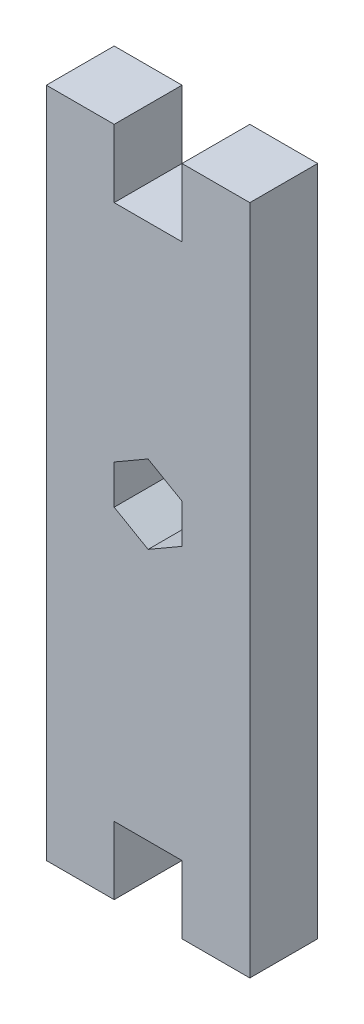
ISO-10303-21;
HEADER;
FILE_DESCRIPTION(('STEP AP214'),'2;1');
FILE_NAME('part.step','',(''),(''),'','','');
FILE_SCHEMA(('AUTOMOTIVE_DESIGN { 1 0 10303 214 1 1 1 1 }'));
ENDSEC;
DATA;
#1=APPLICATION_CONTEXT('core data for automotive mechanical design processes');
#2=APPLICATION_PROTOCOL_DEFINITION('international standard','automotive_design',2000,#1);
#3=PRODUCT_CONTEXT('',#1,'mechanical');
#4=PRODUCT('Part','Part','',(#3));
#5=PRODUCT_RELATED_PRODUCT_CATEGORY('part','',(#4));
#6=PRODUCT_DEFINITION_FORMATION('','',#4);
#7=PRODUCT_DEFINITION_CONTEXT('part definition',#1,'design');
#8=PRODUCT_DEFINITION('design','',#6,#7);
#9=PRODUCT_DEFINITION_SHAPE('','',#8);
#10=(LENGTH_UNIT() NAMED_UNIT(*) SI_UNIT(.MILLI.,.METRE.));
#11=(NAMED_UNIT(*) PLANE_ANGLE_UNIT() SI_UNIT($,.RADIAN.));
#12=(NAMED_UNIT(*) SI_UNIT($,.STERADIAN.) SOLID_ANGLE_UNIT());
#13=UNCERTAINTY_MEASURE_WITH_UNIT(LENGTH_MEASURE(1.E-05),#10,'distance_accuracy_value','');
#14=(GEOMETRIC_REPRESENTATION_CONTEXT(3) GLOBAL_UNCERTAINTY_ASSIGNED_CONTEXT((#13)) GLOBAL_UNIT_ASSIGNED_CONTEXT((#10,
#11,#12)) REPRESENTATION_CONTEXT('',''));
#15=CARTESIAN_POINT('',(0.,0.,0.));
#16=DIRECTION('',(0.,0.,1.));
#17=DIRECTION('',(1.,0.,0.));
#18=AXIS2_PLACEMENT_3D('',#15,#16,#17);
#19=CARTESIAN_POINT('',(-6.53192263334565,2.92543021032505,5.));
#20=DIRECTION('',(1.,0.,0.));
#21=DIRECTION('',(0.,1.,0.));
#22=AXIS2_PLACEMENT_3D('',#19,#20,#21);
#23=PLANE('',#22);
#24=DIRECTION('',(0.,-1.,0.));
#25=VECTOR('',#24,1.);
#26=CARTESIAN_POINT('',(-6.53192263334565,2.92543021032505,0.));
#27=LINE('',#26,#25);
#28=CARTESIAN_POINT('',(-6.53192263334565,2.92543021032505,0.));
#29=VERTEX_POINT('',#28);
#30=CARTESIAN_POINT('',(-6.53192263334564,-46.574569789675,0.));
#31=VERTEX_POINT('',#30);
#32=EDGE_CURVE('E211',#29,#31,#27,.T.);
#33=ORIENTED_EDGE('',*,*,#32,.T.);
#34=DIRECTION('',(0.,0.,-1.));
#35=VECTOR('',#34,1.);
#36=CARTESIAN_POINT('',(-6.53192263334564,-46.574569789675,5.));
#37=LINE('',#36,#35);
#38=CARTESIAN_POINT('',(-6.53192263334564,-46.574569789675,5.));
#39=VERTEX_POINT('',#38);
#40=EDGE_CURVE('E11',#39,#31,#37,.T.);
#41=ORIENTED_EDGE('',*,*,#40,.F.);
#42=DIRECTION('',(0.,-1.,0.));
#43=VECTOR('',#42,1.);
#44=CARTESIAN_POINT('',(-6.53192263334565,2.92543021032505,5.));
#45=LINE('',#44,#43);
#46=CARTESIAN_POINT('',(-6.53192263334565,2.92543021032505,5.));
#47=VERTEX_POINT('',#46);
#48=EDGE_CURVE('E212',#47,#39,#45,.T.);
#49=ORIENTED_EDGE('',*,*,#48,.F.);
#50=DIRECTION('',(0.,0.,-1.));
#51=VECTOR('',#50,1.);
#52=CARTESIAN_POINT('',(-6.53192263334565,2.92543021032505,5.));
#53=LINE('',#52,#51);
#54=EDGE_CURVE('E238',#47,#29,#53,.T.);
#55=ORIENTED_EDGE('',*,*,#54,.T.);
#56=EDGE_LOOP('',(#33,#41,#49,#55));
#57=FACE_BOUND('',#56,.T.);
#58=ADVANCED_FACE('F37',(#57),#23,.F.);
#59=CARTESIAN_POINT('',(-6.53192263334564,-46.574569789675,5.));
#60=DIRECTION('',(0.,1.,0.));
#61=DIRECTION('',(0.,0.,1.));
#62=AXIS2_PLACEMENT_3D('',#59,#60,#61);
#63=PLANE('',#62);
#64=DIRECTION('',(1.,0.,0.));
#65=VECTOR('',#64,1.);
#66=CARTESIAN_POINT('',(-6.53192263334564,-46.574569789675,0.));
#67=LINE('',#66,#65);
#68=CARTESIAN_POINT('',(-1.53192263334564,-46.574569789675,0.));
#69=VERTEX_POINT('',#68);
#70=EDGE_CURVE('E241',#31,#69,#67,.T.);
#71=ORIENTED_EDGE('',*,*,#70,.T.);
#72=DIRECTION('',(0.,0.,-1.));
#73=VECTOR('',#72,1.);
#74=CARTESIAN_POINT('',(-1.53192263334564,-46.574569789675,5.));
#75=LINE('',#74,#73);
#76=CARTESIAN_POINT('',(-1.53192263334564,-46.574569789675,5.));
#77=VERTEX_POINT('',#76);
#78=EDGE_CURVE('E44',#77,#69,#75,.T.);
#79=ORIENTED_EDGE('',*,*,#78,.F.);
#80=DIRECTION('',(1.,0.,0.));
#81=VECTOR('',#80,1.);
#82=CARTESIAN_POINT('',(-6.53192263334564,-46.574569789675,5.));
#83=LINE('',#82,#81);
#84=EDGE_CURVE('E215',#39,#77,#83,.T.);
#85=ORIENTED_EDGE('',*,*,#84,.F.);
#86=ORIENTED_EDGE('',*,*,#40,.T.);
#87=EDGE_LOOP('',(#71,#79,#85,#86));
#88=FACE_BOUND('',#87,.T.);
#89=ADVANCED_FACE('F316',(#88),#63,.F.);
#90=CARTESIAN_POINT('',(-1.53192263334564,-46.574569789675,5.));
#91=DIRECTION('',(-1.,0.,0.));
#92=DIRECTION('',(0.,0.,1.));
#93=AXIS2_PLACEMENT_3D('',#90,#91,#92);
#94=PLANE('',#93);
#95=DIRECTION('',(0.,1.,0.));
#96=VECTOR('',#95,1.);
#97=CARTESIAN_POINT('',(-1.53192263334564,-46.574569789675,0.));
#98=LINE('',#97,#96);
#99=CARTESIAN_POINT('',(-1.53192263334564,-41.5745697896749,0.));
#100=VERTEX_POINT('',#99);
#101=EDGE_CURVE('E243',#69,#100,#98,.T.);
#102=ORIENTED_EDGE('',*,*,#101,.T.);
#103=DIRECTION('',(0.,0.,-1.));
#104=VECTOR('',#103,1.);
#105=CARTESIAN_POINT('',(-1.53192263334564,-41.5745697896749,5.));
#106=LINE('',#105,#104);
#107=CARTESIAN_POINT('',(-1.53192263334564,-41.5745697896749,5.));
#108=VERTEX_POINT('',#107);
#109=EDGE_CURVE('E288',#108,#100,#106,.T.);
#110=ORIENTED_EDGE('',*,*,#109,.F.);
#111=DIRECTION('',(0.,1.,0.));
#112=VECTOR('',#111,1.);
#113=CARTESIAN_POINT('',(-1.53192263334564,-46.574569789675,5.));
#114=LINE('',#113,#112);
#115=EDGE_CURVE('E218',#77,#108,#114,.T.);
#116=ORIENTED_EDGE('',*,*,#115,.F.);
#117=ORIENTED_EDGE('',*,*,#78,.T.);
#118=EDGE_LOOP('',(#102,#110,#116,#117));
#119=FACE_BOUND('',#118,.T.);
#120=ADVANCED_FACE('F295',(#119),#94,.F.);
#121=CARTESIAN_POINT('',(-1.53192263334564,-41.5745697896749,5.));
#122=DIRECTION('',(0.,1.,0.));
#123=DIRECTION('',(0.,0.,1.));
#124=AXIS2_PLACEMENT_3D('',#121,#122,#123);
#125=PLANE('',#124);
#126=DIRECTION('',(1.,0.,0.));
#127=VECTOR('',#126,1.);
#128=CARTESIAN_POINT('',(-1.53192263334564,-41.5745697896749,0.));
#129=LINE('',#128,#127);
#130=CARTESIAN_POINT('',(3.46807736665435,-41.5745697896749,0.));
#131=VERTEX_POINT('',#130);
#132=EDGE_CURVE('E245',#100,#131,#129,.T.);
#133=ORIENTED_EDGE('',*,*,#132,.T.);
#134=DIRECTION('',(0.,0.,-1.));
#135=VECTOR('',#134,1.);
#136=CARTESIAN_POINT('',(3.46807736665435,-41.5745697896749,5.));
#137=LINE('',#136,#135);
#138=CARTESIAN_POINT('',(3.46807736665435,-41.5745697896749,5.));
#139=VERTEX_POINT('',#138);
#140=EDGE_CURVE('E285',#139,#131,#137,.T.);
#141=ORIENTED_EDGE('',*,*,#140,.F.);
#142=DIRECTION('',(1.,0.,0.));
#143=VECTOR('',#142,1.);
#144=CARTESIAN_POINT('',(-1.53192263334564,-41.5745697896749,5.));
#145=LINE('',#144,#143);
#146=EDGE_CURVE('E220',#108,#139,#145,.T.);
#147=ORIENTED_EDGE('',*,*,#146,.F.);
#148=ORIENTED_EDGE('',*,*,#109,.T.);
#149=EDGE_LOOP('',(#133,#141,#147,#148));
#150=FACE_BOUND('',#149,.T.);
#151=ADVANCED_FACE('F304',(#150),#125,.F.);
#152=CARTESIAN_POINT('',(3.46807736665436,-46.574569789675,5.));
#153=DIRECTION('',(1.,0.,0.));
#154=DIRECTION('',(0.,1.,0.));
#155=AXIS2_PLACEMENT_3D('',#152,#153,#154);
#156=PLANE('',#155);
#157=DIRECTION('',(0.,-1.,0.));
#158=VECTOR('',#157,1.);
#159=CARTESIAN_POINT('',(3.46807736665436,-46.574569789675,0.));
#160=LINE('',#159,#158);
#161=CARTESIAN_POINT('',(3.46807736665436,-46.574569789675,0.));
#162=VERTEX_POINT('',#161);
#163=EDGE_CURVE('E247',#131,#162,#160,.T.);
#164=ORIENTED_EDGE('',*,*,#163,.T.);
#165=DIRECTION('',(0.,0.,-1.));
#166=VECTOR('',#165,1.);
#167=CARTESIAN_POINT('',(3.46807736665436,-46.574569789675,5.));
#168=LINE('',#167,#166);
#169=CARTESIAN_POINT('',(3.46807736665436,-46.574569789675,5.));
#170=VERTEX_POINT('',#169);
#171=EDGE_CURVE('E282',#170,#162,#168,.T.);
#172=ORIENTED_EDGE('',*,*,#171,.F.);
#173=DIRECTION('',(0.,-1.,0.));
#174=VECTOR('',#173,1.);
#175=CARTESIAN_POINT('',(3.46807736665436,-46.574569789675,5.));
#176=LINE('',#175,#174);
#177=EDGE_CURVE('E222',#139,#170,#176,.T.);
#178=ORIENTED_EDGE('',*,*,#177,.F.);
#179=ORIENTED_EDGE('',*,*,#140,.T.);
#180=EDGE_LOOP('',(#164,#172,#178,#179));
#181=FACE_BOUND('',#180,.T.);
#182=ADVANCED_FACE('F308',(#181),#156,.F.);
#183=CARTESIAN_POINT('',(3.46807736665436,-46.574569789675,5.));
#184=DIRECTION('',(0.,1.,0.));
#185=DIRECTION('',(0.,0.,1.));
#186=AXIS2_PLACEMENT_3D('',#183,#184,#185);
#187=PLANE('',#186);
#188=DIRECTION('',(1.,0.,0.));
#189=VECTOR('',#188,1.);
#190=CARTESIAN_POINT('',(3.46807736665436,-46.574569789675,0.));
#191=LINE('',#190,#189);
#192=CARTESIAN_POINT('',(8.46807736665436,-46.574569789675,0.));
#193=VERTEX_POINT('',#192);
#194=EDGE_CURVE('E249',#162,#193,#191,.T.);
#195=ORIENTED_EDGE('',*,*,#194,.T.);
#196=DIRECTION('',(0.,0.,-1.));
#197=VECTOR('',#196,1.);
#198=CARTESIAN_POINT('',(8.46807736665436,-46.574569789675,5.));
#199=LINE('',#198,#197);
#200=CARTESIAN_POINT('',(8.46807736665436,-46.574569789675,5.));
#201=VERTEX_POINT('',#200);
#202=EDGE_CURVE('E279',#201,#193,#199,.T.);
#203=ORIENTED_EDGE('',*,*,#202,.F.);
#204=DIRECTION('',(1.,0.,0.));
#205=VECTOR('',#204,1.);
#206=CARTESIAN_POINT('',(3.46807736665436,-46.574569789675,5.));
#207=LINE('',#206,#205);
#208=EDGE_CURVE('E224',#170,#201,#207,.T.);
#209=ORIENTED_EDGE('',*,*,#208,.F.);
#210=ORIENTED_EDGE('',*,*,#171,.T.);
#211=EDGE_LOOP('',(#195,#203,#209,#210));
#212=FACE_BOUND('',#211,.T.);
#213=ADVANCED_FACE('F349',(#212),#187,.F.);
#214=CARTESIAN_POINT('',(8.46807736665435,2.92543021032505,5.));
#215=DIRECTION('',(-1.,0.,0.));
#216=DIRECTION('',(0.,-1.,0.));
#217=AXIS2_PLACEMENT_3D('',#214,#215,#216);
#218=PLANE('',#217);
#219=DIRECTION('',(0.,1.,0.));
#220=VECTOR('',#219,1.);
#221=CARTESIAN_POINT('',(8.46807736665435,2.92543021032505,0.));
#222=LINE('',#221,#220);
#223=CARTESIAN_POINT('',(8.46807736665435,2.92543021032505,0.));
#224=VERTEX_POINT('',#223);
#225=EDGE_CURVE('E251',#193,#224,#222,.T.);
#226=ORIENTED_EDGE('',*,*,#225,.T.);
#227=DIRECTION('',(0.,0.,-1.));
#228=VECTOR('',#227,1.);
#229=CARTESIAN_POINT('',(8.46807736665435,2.92543021032505,5.));
#230=LINE('',#229,#228);
#231=CARTESIAN_POINT('',(8.46807736665435,2.92543021032505,5.));
#232=VERTEX_POINT('',#231);
#233=EDGE_CURVE('E276',#232,#224,#230,.T.);
#234=ORIENTED_EDGE('',*,*,#233,.F.);
#235=DIRECTION('',(0.,1.,0.));
#236=VECTOR('',#235,1.);
#237=CARTESIAN_POINT('',(8.46807736665435,2.92543021032505,5.));
#238=LINE('',#237,#236);
#239=EDGE_CURVE('E226',#201,#232,#238,.T.);
#240=ORIENTED_EDGE('',*,*,#239,.F.);
#241=ORIENTED_EDGE('',*,*,#202,.T.);
#242=EDGE_LOOP('',(#226,#234,#240,#241));
#243=FACE_BOUND('',#242,.T.);
#244=ADVANCED_FACE('F347',(#243),#218,.F.);
#245=CARTESIAN_POINT('',(3.46807736665435,2.92543021032505,5.));
#246=DIRECTION('',(0.,-1.,0.));
#247=DIRECTION('',(0.,0.,-1.));
#248=AXIS2_PLACEMENT_3D('',#245,#246,#247);
#249=PLANE('',#248);
#250=DIRECTION('',(-1.,0.,0.));
#251=VECTOR('',#250,1.);
#252=CARTESIAN_POINT('',(3.46807736665435,2.92543021032505,0.));
#253=LINE('',#252,#251);
#254=CARTESIAN_POINT('',(3.46807736665435,2.92543021032505,0.));
#255=VERTEX_POINT('',#254);
#256=EDGE_CURVE('E253',#224,#255,#253,.T.);
#257=ORIENTED_EDGE('',*,*,#256,.T.);
#258=DIRECTION('',(0.,0.,-1.));
#259=VECTOR('',#258,1.);
#260=CARTESIAN_POINT('',(3.46807736665435,2.92543021032505,5.));
#261=LINE('',#260,#259);
#262=CARTESIAN_POINT('',(3.46807736665435,2.92543021032505,5.));
#263=VERTEX_POINT('',#262);
#264=EDGE_CURVE('E273',#263,#255,#261,.T.);
#265=ORIENTED_EDGE('',*,*,#264,.F.);
#266=DIRECTION('',(-1.,0.,0.));
#267=VECTOR('',#266,1.);
#268=CARTESIAN_POINT('',(3.46807736665435,2.92543021032505,5.));
#269=LINE('',#268,#267);
#270=EDGE_CURVE('E228',#232,#263,#269,.T.);
#271=ORIENTED_EDGE('',*,*,#270,.F.);
#272=ORIENTED_EDGE('',*,*,#233,.T.);
#273=EDGE_LOOP('',(#257,#265,#271,#272));
#274=FACE_BOUND('',#273,.T.);
#275=ADVANCED_FACE('F343',(#274),#249,.F.);
#276=CARTESIAN_POINT('',(3.46807736665435,2.92543021032505,5.));
#277=DIRECTION('',(1.,0.,0.));
#278=DIRECTION('',(0.,1.,0.));
#279=AXIS2_PLACEMENT_3D('',#276,#277,#278);
#280=PLANE('',#279);
#281=DIRECTION('',(0.,-1.,0.));
#282=VECTOR('',#281,1.);
#283=CARTESIAN_POINT('',(3.46807736665435,2.92543021032505,0.));
#284=LINE('',#283,#282);
#285=CARTESIAN_POINT('',(3.46807736665436,-2.07456978967495,0.));
#286=VERTEX_POINT('',#285);
#287=EDGE_CURVE('E255',#255,#286,#284,.T.);
#288=ORIENTED_EDGE('',*,*,#287,.T.);
#289=DIRECTION('',(0.,0.,-1.));
#290=VECTOR('',#289,1.);
#291=CARTESIAN_POINT('',(3.46807736665436,-2.07456978967495,5.));
#292=LINE('',#291,#290);
#293=CARTESIAN_POINT('',(3.46807736665436,-2.07456978967495,5.));
#294=VERTEX_POINT('',#293);
#295=EDGE_CURVE('E270',#294,#286,#292,.T.);
#296=ORIENTED_EDGE('',*,*,#295,.F.);
#297=DIRECTION('',(0.,-1.,0.));
#298=VECTOR('',#297,1.);
#299=CARTESIAN_POINT('',(3.46807736665435,2.92543021032505,5.));
#300=LINE('',#299,#298);
#301=EDGE_CURVE('E230',#263,#294,#300,.T.);
#302=ORIENTED_EDGE('',*,*,#301,.F.);
#303=ORIENTED_EDGE('',*,*,#264,.T.);
#304=EDGE_LOOP('',(#288,#296,#302,#303));
#305=FACE_BOUND('',#304,.T.);
#306=ADVANCED_FACE('F338',(#305),#280,.F.);
#307=CARTESIAN_POINT('',(-1.53192263334565,-2.07456978967495,5.));
#308=DIRECTION('',(0.,-1.,0.));
#309=DIRECTION('',(1.,0.,0.));
#310=AXIS2_PLACEMENT_3D('',#307,#308,#309);
#311=PLANE('',#310);
#312=DIRECTION('',(-1.,0.,0.));
#313=VECTOR('',#312,1.);
#314=CARTESIAN_POINT('',(-1.53192263334565,-2.07456978967495,0.));
#315=LINE('',#314,#313);
#316=CARTESIAN_POINT('',(-1.53192263334565,-2.07456978967495,0.));
#317=VERTEX_POINT('',#316);
#318=EDGE_CURVE('E257',#286,#317,#315,.T.);
#319=ORIENTED_EDGE('',*,*,#318,.T.);
#320=DIRECTION('',(0.,0.,-1.));
#321=VECTOR('',#320,1.);
#322=CARTESIAN_POINT('',(-1.53192263334565,-2.07456978967495,5.));
#323=LINE('',#322,#321);
#324=CARTESIAN_POINT('',(-1.53192263334565,-2.07456978967495,5.));
#325=VERTEX_POINT('',#324);
#326=EDGE_CURVE('E267',#325,#317,#323,.T.);
#327=ORIENTED_EDGE('',*,*,#326,.F.);
#328=DIRECTION('',(-1.,0.,0.));
#329=VECTOR('',#328,1.);
#330=CARTESIAN_POINT('',(-1.53192263334565,-2.07456978967495,5.));
#331=LINE('',#330,#329);
#332=EDGE_CURVE('E232',#294,#325,#331,.T.);
#333=ORIENTED_EDGE('',*,*,#332,.F.);
#334=ORIENTED_EDGE('',*,*,#295,.T.);
#335=EDGE_LOOP('',(#319,#327,#333,#334));
#336=FACE_BOUND('',#335,.T.);
#337=ADVANCED_FACE('F332',(#336),#311,.F.);
#338=CARTESIAN_POINT('',(-1.53192263334564,2.92543021032505,5.));
#339=DIRECTION('',(-1.,0.,0.));
#340=DIRECTION('',(0.,-1.,0.));
#341=AXIS2_PLACEMENT_3D('',#338,#339,#340);
#342=PLANE('',#341);
#343=DIRECTION('',(0.,1.,0.));
#344=VECTOR('',#343,1.);
#345=CARTESIAN_POINT('',(-1.53192263334564,2.92543021032505,0.));
#346=LINE('',#345,#344);
#347=CARTESIAN_POINT('',(-1.53192263334564,2.92543021032505,0.));
#348=VERTEX_POINT('',#347);
#349=EDGE_CURVE('E259',#317,#348,#346,.T.);
#350=ORIENTED_EDGE('',*,*,#349,.T.);
#351=DIRECTION('',(0.,0.,-1.));
#352=VECTOR('',#351,1.);
#353=CARTESIAN_POINT('',(-1.53192263334564,2.92543021032505,5.));
#354=LINE('',#353,#352);
#355=CARTESIAN_POINT('',(-1.53192263334564,2.92543021032505,5.));
#356=VERTEX_POINT('',#355);
#357=EDGE_CURVE('E264',#356,#348,#354,.T.);
#358=ORIENTED_EDGE('',*,*,#357,.F.);
#359=DIRECTION('',(0.,1.,0.));
#360=VECTOR('',#359,1.);
#361=CARTESIAN_POINT('',(-1.53192263334564,2.92543021032505,5.));
#362=LINE('',#361,#360);
#363=EDGE_CURVE('E234',#325,#356,#362,.T.);
#364=ORIENTED_EDGE('',*,*,#363,.F.);
#365=ORIENTED_EDGE('',*,*,#326,.T.);
#366=EDGE_LOOP('',(#350,#358,#364,#365));
#367=FACE_BOUND('',#366,.T.);
#368=ADVANCED_FACE('F328',(#367),#342,.F.);
#369=CARTESIAN_POINT('',(-6.53192263334565,2.92543021032505,5.));
#370=DIRECTION('',(0.,-1.,0.));
#371=DIRECTION('',(1.,0.,0.));
#372=AXIS2_PLACEMENT_3D('',#369,#370,#371);
#373=PLANE('',#372);
#374=DIRECTION('',(-1.,0.,0.));
#375=VECTOR('',#374,1.);
#376=CARTESIAN_POINT('',(-6.53192263334565,2.92543021032505,0.));
#377=LINE('',#376,#375);
#378=EDGE_CURVE('E216',#348,#29,#377,.T.);
#379=ORIENTED_EDGE('',*,*,#378,.T.);
#380=ORIENTED_EDGE('',*,*,#54,.F.);
#381=DIRECTION('',(-1.,0.,0.));
#382=VECTOR('',#381,1.);
#383=CARTESIAN_POINT('',(-6.53192263334565,2.92543021032505,5.));
#384=LINE('',#383,#382);
#385=EDGE_CURVE('E236',#356,#47,#384,.T.);
#386=ORIENTED_EDGE('',*,*,#385,.F.);
#387=ORIENTED_EDGE('',*,*,#357,.T.);
#388=EDGE_LOOP('',(#379,#380,#386,#387));
#389=FACE_BOUND('',#388,.T.);
#390=ADVANCED_FACE('F323',(#389),#373,.F.);
#391=CARTESIAN_POINT('',(0.,0.,5.));
#392=DIRECTION('',(0.,0.,1.));
#393=DIRECTION('',(1.,0.,0.));
#394=AXIS2_PLACEMENT_3D('',#391,#392,#393);
#395=PLANE('',#394);
#396=DIRECTION('',(0.,1.,0.));
#397=VECTOR('',#396,1.);
#398=CARTESIAN_POINT('',(3.46807736665436,0.,5.));
#399=LINE('',#398,#397);
#400=CARTESIAN_POINT('',(3.46807736665435,-21.517945462649,5.));
#401=VERTEX_POINT('',#400);
#402=CARTESIAN_POINT('',(3.46807736665435,-18.6311941167009,5.));
#403=VERTEX_POINT('',#402);
#404=EDGE_CURVE('E209',#401,#403,#399,.T.);
#405=ORIENTED_EDGE('',*,*,#404,.F.);
#406=DIRECTION('',(0.866025403784439,0.5,0.));
#407=VECTOR('',#406,1.);
#408=CARTESIAN_POINT('',(10.1845630456147,-17.640180647893,5.));
#409=LINE('',#408,#407);
#410=CARTESIAN_POINT('',(0.968077366654351,-22.9613211356231,5.));
#411=VERTEX_POINT('',#410);
#412=EDGE_CURVE('E194',#411,#401,#409,.T.);
#413=ORIENTED_EDGE('',*,*,#412,.F.);
#414=DIRECTION('',(0.866025403784439,-0.5,0.));
#415=VECTOR('',#414,1.);
#416=CARTESIAN_POINT('',(-9.70052436228748,-16.8018010555416,5.));
#417=LINE('',#416,#415);
#418=CARTESIAN_POINT('',(-1.53192263334565,-21.517945462649,5.));
#419=VERTEX_POINT('',#418);
#420=EDGE_CURVE('E167',#419,#411,#417,.T.);
#421=ORIENTED_EDGE('',*,*,#420,.F.);
#422=DIRECTION('',(0.,-1.,0.));
#423=VECTOR('',#422,1.);
#424=CARTESIAN_POINT('',(-1.53192263334565,0.,5.));
#425=LINE('',#424,#423);
#426=CARTESIAN_POINT('',(-1.53192263334565,-18.6311941167009,5.));
#427=VERTEX_POINT('',#426);
#428=EDGE_CURVE('E203',#427,#419,#425,.T.);
#429=ORIENTED_EDGE('',*,*,#428,.F.);
#430=DIRECTION('',(-0.866025403784439,-0.5,0.));
#431=VECTOR('',#430,1.);
#432=CARTESIAN_POINT('',(7.68456304561465,-13.3100536289708,5.));
#433=LINE('',#432,#431);
#434=CARTESIAN_POINT('',(0.968077366654353,-17.1878184437268,5.));
#435=VERTEX_POINT('',#434);
#436=EDGE_CURVE('E205',#435,#427,#433,.T.);
#437=ORIENTED_EDGE('',*,*,#436,.F.);
#438=DIRECTION('',(-0.866025403784439,0.499999999999999,0.));
#439=VECTOR('',#438,1.);
#440=CARTESIAN_POINT('',(-7.20052436228747,-12.4716740366194,5.));
#441=LINE('',#440,#439);
#442=EDGE_CURVE('E207',#403,#435,#441,.T.);
#443=ORIENTED_EDGE('',*,*,#442,.F.);
#444=EDGE_LOOP('',(#405,#413,#421,#429,#437,#443));
#445=FACE_BOUND('',#444,.T.);
#446=ORIENTED_EDGE('',*,*,#48,.T.);
#447=ORIENTED_EDGE('',*,*,#84,.T.);
#448=ORIENTED_EDGE('',*,*,#115,.T.);
#449=ORIENTED_EDGE('',*,*,#146,.T.);
#450=ORIENTED_EDGE('',*,*,#177,.T.);
#451=ORIENTED_EDGE('',*,*,#208,.T.);
#452=ORIENTED_EDGE('',*,*,#239,.T.);
#453=ORIENTED_EDGE('',*,*,#270,.T.);
#454=ORIENTED_EDGE('',*,*,#301,.T.);
#455=ORIENTED_EDGE('',*,*,#332,.T.);
#456=ORIENTED_EDGE('',*,*,#363,.T.);
#457=ORIENTED_EDGE('',*,*,#385,.T.);
#458=EDGE_LOOP('',(#446,#447,#448,#449,#450,#451,#452,#453,#454,#455,#456,#457));
#459=FACE_BOUND('',#458,.T.);
#460=ADVANCED_FACE('F312',(#445,#459),#395,.T.);
#461=CARTESIAN_POINT('',(0.,0.,0.));
#462=DIRECTION('',(0.,0.,1.));
#463=DIRECTION('',(1.,0.,0.));
#464=AXIS2_PLACEMENT_3D('',#461,#462,#463);
#465=PLANE('',#464);
#466=DIRECTION('',(-0.866025403784439,-0.5,0.));
#467=VECTOR('',#466,1.);
#468=CARTESIAN_POINT('',(3.46807736665435,-21.517945462649,0.));
#469=LINE('',#468,#467);
#470=CARTESIAN_POINT('',(3.46807736665435,-21.517945462649,0.));
#471=VERTEX_POINT('',#470);
#472=CARTESIAN_POINT('',(0.968077366654351,-22.9613211356231,0.));
#473=VERTEX_POINT('',#472);
#474=EDGE_CURVE('E173',#471,#473,#469,.T.);
#475=ORIENTED_EDGE('',*,*,#474,.F.);
#476=DIRECTION('',(0.,-1.,0.));
#477=VECTOR('',#476,1.);
#478=CARTESIAN_POINT('',(3.46807736665435,-18.6311941167009,0.));
#479=LINE('',#478,#477);
#480=CARTESIAN_POINT('',(3.46807736665435,-18.6311941167009,0.));
#481=VERTEX_POINT('',#480);
#482=EDGE_CURVE('E59',#481,#471,#479,.T.);
#483=ORIENTED_EDGE('',*,*,#482,.F.);
#484=DIRECTION('',(0.866025403784439,-0.499999999999999,0.));
#485=VECTOR('',#484,1.);
#486=CARTESIAN_POINT('',(0.968077366654353,-17.1878184437268,0.));
#487=LINE('',#486,#485);
#488=CARTESIAN_POINT('',(0.968077366654353,-17.1878184437268,0.));
#489=VERTEX_POINT('',#488);
#490=EDGE_CURVE('E189',#489,#481,#487,.T.);
#491=ORIENTED_EDGE('',*,*,#490,.F.);
#492=DIRECTION('',(0.866025403784439,0.499999999999999,0.));
#493=VECTOR('',#492,1.);
#494=CARTESIAN_POINT('',(-1.53192263334565,-18.6311941167009,0.));
#495=LINE('',#494,#493);
#496=CARTESIAN_POINT('',(-1.53192263334565,-18.6311941167009,0.));
#497=VERTEX_POINT('',#496);
#498=EDGE_CURVE('E183',#497,#489,#495,.T.);
#499=ORIENTED_EDGE('',*,*,#498,.F.);
#500=DIRECTION('',(0.,1.,0.));
#501=VECTOR('',#500,1.);
#502=CARTESIAN_POINT('',(-1.53192263334565,-21.517945462649,0.));
#503=LINE('',#502,#501);
#504=CARTESIAN_POINT('',(-1.53192263334565,-21.517945462649,0.));
#505=VERTEX_POINT('',#504);
#506=EDGE_CURVE('E181',#505,#497,#503,.T.);
#507=ORIENTED_EDGE('',*,*,#506,.F.);
#508=DIRECTION('',(-0.866025403784439,0.5,0.));
#509=VECTOR('',#508,1.);
#510=CARTESIAN_POINT('',(0.968077366654351,-22.9613211356231,0.));
#511=LINE('',#510,#509);
#512=EDGE_CURVE('E164',#473,#505,#511,.T.);
#513=ORIENTED_EDGE('',*,*,#512,.F.);
#514=EDGE_LOOP('',(#475,#483,#491,#499,#507,#513));
#515=FACE_BOUND('',#514,.T.);
#516=ORIENTED_EDGE('',*,*,#32,.F.);
#517=ORIENTED_EDGE('',*,*,#378,.F.);
#518=ORIENTED_EDGE('',*,*,#349,.F.);
#519=ORIENTED_EDGE('',*,*,#318,.F.);
#520=ORIENTED_EDGE('',*,*,#287,.F.);
#521=ORIENTED_EDGE('',*,*,#256,.F.);
#522=ORIENTED_EDGE('',*,*,#225,.F.);
#523=ORIENTED_EDGE('',*,*,#194,.F.);
#524=ORIENTED_EDGE('',*,*,#163,.F.);
#525=ORIENTED_EDGE('',*,*,#132,.F.);
#526=ORIENTED_EDGE('',*,*,#101,.F.);
#527=ORIENTED_EDGE('',*,*,#70,.F.);
#528=EDGE_LOOP('',(#516,#517,#518,#519,#520,#521,#522,#523,#524,#525,#526,#527));
#529=FACE_BOUND('',#528,.T.);
#530=ADVANCED_FACE('F177',(#515,#529),#465,.F.);
#531=CARTESIAN_POINT('',(3.46807736665435,-18.6311941167009,10.));
#532=DIRECTION('',(1.,0.,0.));
#533=DIRECTION('',(0.,1.,0.));
#534=AXIS2_PLACEMENT_3D('',#531,#532,#533);
#535=PLANE('',#534);
#536=ORIENTED_EDGE('',*,*,#404,.T.);
#537=DIRECTION('',(0.,0.,-1.));
#538=VECTOR('',#537,1.);
#539=CARTESIAN_POINT('',(3.46807736665435,-18.6311941167009,10.));
#540=LINE('',#539,#538);
#541=EDGE_CURVE('E192',#403,#481,#540,.T.);
#542=ORIENTED_EDGE('',*,*,#541,.T.);
#543=ORIENTED_EDGE('',*,*,#482,.T.);
#544=DIRECTION('',(0.,0.,-1.));
#545=VECTOR('',#544,1.);
#546=CARTESIAN_POINT('',(3.46807736665435,-21.517945462649,10.));
#547=LINE('',#546,#545);
#548=EDGE_CURVE('E170',#401,#471,#547,.T.);
#549=ORIENTED_EDGE('',*,*,#548,.F.);
#550=EDGE_LOOP('',(#536,#542,#543,#549));
#551=FACE_BOUND('',#550,.T.);
#552=ADVANCED_FACE('F444',(#551),#535,.F.);
#553=CARTESIAN_POINT('',(0.968077366654353,-17.1878184437268,10.));
#554=DIRECTION('',(0.499999999999999,0.866025403784439,0.));
#555=DIRECTION('',(-0.866025403784439,0.499999999999999,0.));
#556=AXIS2_PLACEMENT_3D('',#553,#554,#555);
#557=PLANE('',#556);
#558=ORIENTED_EDGE('',*,*,#442,.T.);
#559=DIRECTION('',(0.,0.,-1.));
#560=VECTOR('',#559,1.);
#561=CARTESIAN_POINT('',(0.968077366654353,-17.1878184437268,10.));
#562=LINE('',#561,#560);
#563=EDGE_CURVE('E195',#435,#489,#562,.T.);
#564=ORIENTED_EDGE('',*,*,#563,.T.);
#565=ORIENTED_EDGE('',*,*,#490,.T.);
#566=ORIENTED_EDGE('',*,*,#541,.F.);
#567=EDGE_LOOP('',(#558,#564,#565,#566));
#568=FACE_BOUND('',#567,.T.);
#569=ADVANCED_FACE('F453',(#568),#557,.F.);
#570=CARTESIAN_POINT('',(-1.53192263334565,-18.6311941167009,10.));
#571=DIRECTION('',(-0.5,0.866025403784439,0.));
#572=DIRECTION('',(-0.866025403784439,-0.5,0.));
#573=AXIS2_PLACEMENT_3D('',#570,#571,#572);
#574=PLANE('',#573);
#575=ORIENTED_EDGE('',*,*,#436,.T.);
#576=DIRECTION('',(0.,0.,-1.));
#577=VECTOR('',#576,1.);
#578=CARTESIAN_POINT('',(-1.53192263334565,-18.6311941167009,10.));
#579=LINE('',#578,#577);
#580=EDGE_CURVE('E197',#427,#497,#579,.T.);
#581=ORIENTED_EDGE('',*,*,#580,.T.);
#582=ORIENTED_EDGE('',*,*,#498,.T.);
#583=ORIENTED_EDGE('',*,*,#563,.F.);
#584=EDGE_LOOP('',(#575,#581,#582,#583));
#585=FACE_BOUND('',#584,.T.);
#586=ADVANCED_FACE('F462',(#585),#574,.F.);
#587=CARTESIAN_POINT('',(-1.53192263334565,-21.517945462649,10.));
#588=DIRECTION('',(-1.,0.,0.));
#589=DIRECTION('',(0.,0.,1.));
#590=AXIS2_PLACEMENT_3D('',#587,#588,#589);
#591=PLANE('',#590);
#592=ORIENTED_EDGE('',*,*,#428,.T.);
#593=DIRECTION('',(0.,0.,-1.));
#594=VECTOR('',#593,1.);
#595=CARTESIAN_POINT('',(-1.53192263334565,-21.517945462649,10.));
#596=LINE('',#595,#594);
#597=EDGE_CURVE('E169',#419,#505,#596,.T.);
#598=ORIENTED_EDGE('',*,*,#597,.T.);
#599=ORIENTED_EDGE('',*,*,#506,.T.);
#600=ORIENTED_EDGE('',*,*,#580,.F.);
#601=EDGE_LOOP('',(#592,#598,#599,#600));
#602=FACE_BOUND('',#601,.T.);
#603=ADVANCED_FACE('F472',(#602),#591,.F.);
#604=CARTESIAN_POINT('',(0.968077366654351,-22.9613211356231,10.));
#605=DIRECTION('',(-0.5,-0.866025403784439,0.));
#606=DIRECTION('',(0.866025403784439,-0.5,0.));
#607=AXIS2_PLACEMENT_3D('',#604,#605,#606);
#608=PLANE('',#607);
#609=ORIENTED_EDGE('',*,*,#420,.T.);
#610=DIRECTION('',(0.,0.,-1.));
#611=VECTOR('',#610,1.);
#612=CARTESIAN_POINT('',(0.968077366654351,-22.9613211356231,10.));
#613=LINE('',#612,#611);
#614=EDGE_CURVE('E51',#411,#473,#613,.T.);
#615=ORIENTED_EDGE('',*,*,#614,.T.);
#616=ORIENTED_EDGE('',*,*,#512,.T.);
#617=ORIENTED_EDGE('',*,*,#597,.F.);
#618=EDGE_LOOP('',(#609,#615,#616,#617));
#619=FACE_BOUND('',#618,.T.);
#620=ADVANCED_FACE('F161',(#619),#608,.F.);
#621=CARTESIAN_POINT('',(3.46807736665435,-21.517945462649,10.));
#622=DIRECTION('',(0.5,-0.866025403784439,0.));
#623=DIRECTION('',(0.866025403784439,0.5,0.));
#624=AXIS2_PLACEMENT_3D('',#621,#622,#623);
#625=PLANE('',#624);
#626=ORIENTED_EDGE('',*,*,#412,.T.);
#627=ORIENTED_EDGE('',*,*,#548,.T.);
#628=ORIENTED_EDGE('',*,*,#474,.T.);
#629=ORIENTED_EDGE('',*,*,#614,.F.);
#630=EDGE_LOOP('',(#626,#627,#628,#629));
#631=FACE_BOUND('',#630,.T.);
#632=ADVANCED_FACE('F174',(#631),#625,.F.);
#633=CLOSED_SHELL('',(#58,#89,#120,#151,#182,#213,#244,#275,#306,#337,#368,#390,#460,#530,#552,
#569,#586,#603,#620,#632));
#634=MANIFOLD_SOLID_BREP('B2',#633);
#635=ADVANCED_BREP_SHAPE_REPRESENTATION('',(#18,#634),#14);
#636=SHAPE_DEFINITION_REPRESENTATION(#9,#635);
ENDSEC;
END-ISO-10303-21;
